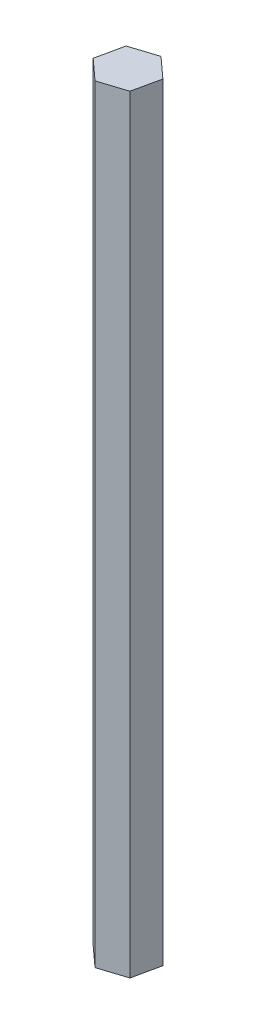
ISO-10303-21;
HEADER;
FILE_DESCRIPTION(('STEP AP214'),'2;1');
FILE_NAME('part.step','',(''),(''),'','','');
FILE_SCHEMA(('AUTOMOTIVE_DESIGN { 1 0 10303 214 1 1 1 1 }'));
ENDSEC;
DATA;
#1=APPLICATION_CONTEXT('core data for automotive mechanical design processes');
#2=APPLICATION_PROTOCOL_DEFINITION('international standard','automotive_design',2000,#1);
#3=PRODUCT_CONTEXT('',#1,'mechanical');
#4=PRODUCT('Part','Part','',(#3));
#5=PRODUCT_RELATED_PRODUCT_CATEGORY('part','',(#4));
#6=PRODUCT_DEFINITION_FORMATION('','',#4);
#7=PRODUCT_DEFINITION_CONTEXT('part definition',#1,'design');
#8=PRODUCT_DEFINITION('design','',#6,#7);
#9=PRODUCT_DEFINITION_SHAPE('','',#8);
#10=(LENGTH_UNIT() NAMED_UNIT(*) SI_UNIT(.MILLI.,.METRE.));
#11=(NAMED_UNIT(*) PLANE_ANGLE_UNIT() SI_UNIT($,.RADIAN.));
#12=(NAMED_UNIT(*) SI_UNIT($,.STERADIAN.) SOLID_ANGLE_UNIT());
#13=UNCERTAINTY_MEASURE_WITH_UNIT(LENGTH_MEASURE(1.E-05),#10,'distance_accuracy_value','');
#14=(GEOMETRIC_REPRESENTATION_CONTEXT(3) GLOBAL_UNCERTAINTY_ASSIGNED_CONTEXT((#13)) GLOBAL_UNIT_ASSIGNED_CONTEXT((#10,
#11,#12)) REPRESENTATION_CONTEXT('',''));
#15=CARTESIAN_POINT('',(0.,0.,0.));
#16=DIRECTION('',(0.,0.,1.));
#17=DIRECTION('',(1.,0.,0.));
#18=AXIS2_PLACEMENT_3D('',#15,#16,#17);
#19=CARTESIAN_POINT('',(-0.61182187926995,127.,2.82117126764399));
#20=DIRECTION('',(-0.305094633460301,0.,-0.952322038300976));
#21=DIRECTION('',(-0.952322038300976,0.,0.305094633460301));
#22=AXIS2_PLACEMENT_3D('',#19,#20,#21);
#23=PLANE('',#22);
#24=DIRECTION('',(0.,-1.,0.));
#25=VECTOR('',#24,1.);
#26=CARTESIAN_POINT('',(-0.61182187926995,127.,2.82117126764399));
#27=LINE('',#26,#25);
#28=CARTESIAN_POINT('',(-0.61182187926995,127.,2.82117126764399));
#29=VERTEX_POINT('',#28);
#30=CARTESIAN_POINT('',(-0.611821879270038,47.06,2.82117126764398));
#31=VERTEX_POINT('',#30);
#32=EDGE_CURVE('E148',#29,#31,#27,.T.);
#33=ORIENTED_EDGE('',*,*,#32,.T.);
#34=DIRECTION('',(-0.952322038300984,0.,0.305094633460273));
#35=VECTOR('',#34,1.);
#36=CARTESIAN_POINT('',(2.13729504657141,47.06,1.94043892386098));
#37=LINE('',#36,#35);
#38=CARTESIAN_POINT('',(2.13729504657141,47.06,1.94043892386098));
#39=VERTEX_POINT('',#38);
#40=EDGE_CURVE('E124',#39,#31,#37,.T.);
#41=ORIENTED_EDGE('',*,*,#40,.F.);
#42=DIRECTION('',(0.,-1.,0.));
#43=VECTOR('',#42,1.);
#44=CARTESIAN_POINT('',(2.13729504657146,127.,1.94043892386091));
#45=LINE('',#44,#43);
#46=CARTESIAN_POINT('',(2.13729504657146,127.,1.94043892386091));
#47=VERTEX_POINT('',#46);
#48=EDGE_CURVE('E11',#47,#39,#45,.T.);
#49=ORIENTED_EDGE('',*,*,#48,.F.);
#50=DIRECTION('',(0.952322038300976,0.,-0.305094633460301));
#51=VECTOR('',#50,1.);
#52=CARTESIAN_POINT('',(-0.61182187926995,127.,2.82117126764399));
#53=LINE('',#52,#51);
#54=EDGE_CURVE('E133',#29,#47,#53,.T.);
#55=ORIENTED_EDGE('',*,*,#54,.F.);
#56=EDGE_LOOP('',(#33,#41,#49,#55));
#57=FACE_BOUND('',#56,.T.);
#58=ADVANCED_FACE('F39',(#57),#23,.F.);
#59=CARTESIAN_POINT('',(2.13729504657146,127.,1.94043892386091));
#60=DIRECTION('',(-0.977282394482572,0.,-0.211941316015566));
#61=DIRECTION('',(-0.211941316015566,0.,0.977282394482572));
#62=AXIS2_PLACEMENT_3D('',#59,#60,#61);
#63=PLANE('',#62);
#64=ORIENTED_EDGE('',*,*,#48,.T.);
#65=DIRECTION('',(-0.211941316015594,0.,0.977282394482566));
#66=VECTOR('',#65,1.);
#67=CARTESIAN_POINT('',(2.74911692584145,47.06,-0.880732343782998));
#68=LINE('',#67,#66);
#69=CARTESIAN_POINT('',(2.74911692584145,47.06,-0.880732343782998));
#70=VERTEX_POINT('',#69);
#71=EDGE_CURVE('E112',#70,#39,#68,.T.);
#72=ORIENTED_EDGE('',*,*,#71,.F.);
#73=DIRECTION('',(0.,-1.,0.));
#74=VECTOR('',#73,1.);
#75=CARTESIAN_POINT('',(2.74911692584142,127.,-0.880732343783076));
#76=LINE('',#75,#74);
#77=CARTESIAN_POINT('',(2.74911692584142,127.,-0.880732343783076));
#78=VERTEX_POINT('',#77);
#79=EDGE_CURVE('E47',#78,#70,#76,.T.);
#80=ORIENTED_EDGE('',*,*,#79,.F.);
#81=DIRECTION('',(0.211941316015566,0.,-0.977282394482572));
#82=VECTOR('',#81,1.);
#83=CARTESIAN_POINT('',(2.13729504657146,127.,1.94043892386091));
#84=LINE('',#83,#82);
#85=EDGE_CURVE('E136',#47,#78,#84,.T.);
#86=ORIENTED_EDGE('',*,*,#85,.F.);
#87=EDGE_LOOP('',(#64,#72,#80,#86));
#88=FACE_BOUND('',#87,.T.);
#89=ADVANCED_FACE('F167',(#88),#63,.F.);
#90=CARTESIAN_POINT('',(2.74911692584142,127.,-0.880732343783076));
#91=DIRECTION('',(-0.672187761022271,0.,0.74038072228541));
#92=DIRECTION('',(0.74038072228541,0.,0.672187761022271));
#93=AXIS2_PLACEMENT_3D('',#90,#91,#92);
#94=PLANE('',#93);
#95=ORIENTED_EDGE('',*,*,#79,.T.);
#96=DIRECTION('',(0.74038072228539,0.,0.672187761022294));
#97=VECTOR('',#96,1.);
#98=CARTESIAN_POINT('',(0.611821879270039,47.06,-2.82117126764398));
#99=LINE('',#98,#97);
#100=CARTESIAN_POINT('',(0.611821879270039,47.06,-2.82117126764398));
#101=VERTEX_POINT('',#100);
#102=EDGE_CURVE('E105',#101,#70,#99,.T.);
#103=ORIENTED_EDGE('',*,*,#102,.F.);
#104=DIRECTION('',(0.,-1.,0.));
#105=VECTOR('',#104,1.);
#106=CARTESIAN_POINT('',(0.611821879269952,127.,-2.82117126764399));
#107=LINE('',#106,#105);
#108=CARTESIAN_POINT('',(0.611821879269952,127.,-2.82117126764399));
#109=VERTEX_POINT('',#108);
#110=EDGE_CURVE('E92',#109,#101,#107,.T.);
#111=ORIENTED_EDGE('',*,*,#110,.F.);
#112=DIRECTION('',(-0.74038072228541,0.,-0.672187761022271));
#113=VECTOR('',#112,1.);
#114=CARTESIAN_POINT('',(2.74911692584142,127.,-0.880732343783076));
#115=LINE('',#114,#113);
#116=EDGE_CURVE('E139',#78,#109,#115,.T.);
#117=ORIENTED_EDGE('',*,*,#116,.F.);
#118=EDGE_LOOP('',(#95,#103,#111,#117));
#119=FACE_BOUND('',#118,.T.);
#120=ADVANCED_FACE('F106',(#119),#94,.F.);
#121=CARTESIAN_POINT('',(0.611821879269952,127.,-2.82117126764399));
#122=DIRECTION('',(0.305094633460301,0.,0.952322038300975));
#123=DIRECTION('',(0.952322038300976,0.,-0.305094633460301));
#124=AXIS2_PLACEMENT_3D('',#121,#122,#123);
#125=PLANE('',#124);
#126=ORIENTED_EDGE('',*,*,#110,.T.);
#127=DIRECTION('',(0.952322038300984,0.,-0.305094633460273));
#128=VECTOR('',#127,1.);
#129=CARTESIAN_POINT('',(-2.13729504657141,47.06,-1.94043892386098));
#130=LINE('',#129,#128);
#131=CARTESIAN_POINT('',(-2.13729504657141,47.06,-1.94043892386098));
#132=VERTEX_POINT('',#131);
#133=EDGE_CURVE('E97',#132,#101,#130,.T.);
#134=ORIENTED_EDGE('',*,*,#133,.F.);
#135=DIRECTION('',(0.,-1.,0.));
#136=VECTOR('',#135,1.);
#137=CARTESIAN_POINT('',(-2.13729504657146,127.,-1.94043892386091));
#138=LINE('',#137,#136);
#139=CARTESIAN_POINT('',(-2.13729504657146,127.,-1.94043892386091));
#140=VERTEX_POINT('',#139);
#141=EDGE_CURVE('E102',#140,#132,#138,.T.);
#142=ORIENTED_EDGE('',*,*,#141,.F.);
#143=DIRECTION('',(-0.952322038300976,0.,0.305094633460301));
#144=VECTOR('',#143,1.);
#145=CARTESIAN_POINT('',(0.611821879269952,127.,-2.82117126764399));
#146=LINE('',#145,#144);
#147=EDGE_CURVE('E98',#109,#140,#146,.T.);
#148=ORIENTED_EDGE('',*,*,#147,.F.);
#149=EDGE_LOOP('',(#126,#134,#142,#148));
#150=FACE_BOUND('',#149,.T.);
#151=ADVANCED_FACE('F94',(#150),#125,.F.);
#152=CARTESIAN_POINT('',(-2.13729504657146,127.,-1.94043892386091));
#153=DIRECTION('',(0.977282394482573,0.,0.211941316015565));
#154=DIRECTION('',(0.211941316015565,0.,-0.977282394482573));
#155=AXIS2_PLACEMENT_3D('',#152,#153,#154);
#156=PLANE('',#155);
#157=ORIENTED_EDGE('',*,*,#141,.T.);
#158=DIRECTION('',(0.211941316015594,0.,-0.977282394482566));
#159=VECTOR('',#158,1.);
#160=CARTESIAN_POINT('',(-2.74911692584145,47.06,0.880732343783));
#161=LINE('',#160,#159);
#162=CARTESIAN_POINT('',(-2.74911692584145,47.06,0.880732343783));
#163=VERTEX_POINT('',#162);
#164=EDGE_CURVE('E118',#163,#132,#161,.T.);
#165=ORIENTED_EDGE('',*,*,#164,.F.);
#166=DIRECTION('',(0.,-1.,0.));
#167=VECTOR('',#166,1.);
#168=CARTESIAN_POINT('',(-2.74911692584141,127.,0.88073234378308));
#169=LINE('',#168,#167);
#170=CARTESIAN_POINT('',(-2.74911692584141,127.,0.88073234378308));
#171=VERTEX_POINT('',#170);
#172=EDGE_CURVE('E151',#171,#163,#169,.T.);
#173=ORIENTED_EDGE('',*,*,#172,.F.);
#174=DIRECTION('',(-0.211941316015565,0.,0.977282394482572));
#175=VECTOR('',#174,1.);
#176=CARTESIAN_POINT('',(-2.13729504657146,127.,-1.94043892386091));
#177=LINE('',#176,#175);
#178=EDGE_CURVE('E59',#140,#171,#177,.T.);
#179=ORIENTED_EDGE('',*,*,#178,.F.);
#180=EDGE_LOOP('',(#157,#165,#173,#179));
#181=FACE_BOUND('',#180,.T.);
#182=ADVANCED_FACE('F157',(#181),#156,.F.);
#183=CARTESIAN_POINT('',(-2.74911692584141,127.,0.88073234378308));
#184=DIRECTION('',(0.672187761022271,0.,-0.74038072228541));
#185=DIRECTION('',(-0.740380722285411,0.,-0.672187761022271));
#186=AXIS2_PLACEMENT_3D('',#183,#184,#185);
#187=PLANE('',#186);
#188=ORIENTED_EDGE('',*,*,#172,.T.);
#189=DIRECTION('',(-0.74038072228539,0.,-0.672187761022293));
#190=VECTOR('',#189,1.);
#191=CARTESIAN_POINT('',(-0.611821879270038,47.06,2.82117126764398));
#192=LINE('',#191,#190);
#193=EDGE_CURVE('E128',#31,#163,#192,.T.);
#194=ORIENTED_EDGE('',*,*,#193,.F.);
#195=ORIENTED_EDGE('',*,*,#32,.F.);
#196=DIRECTION('',(0.740380722285411,0.,0.672187761022271));
#197=VECTOR('',#196,1.);
#198=CARTESIAN_POINT('',(-2.74911692584141,127.,0.88073234378308));
#199=LINE('',#198,#197);
#200=EDGE_CURVE('E54',#171,#29,#199,.T.);
#201=ORIENTED_EDGE('',*,*,#200,.F.);
#202=EDGE_LOOP('',(#188,#194,#195,#201));
#203=FACE_BOUND('',#202,.T.);
#204=ADVANCED_FACE('F160',(#203),#187,.F.);
#205=CARTESIAN_POINT('',(0.,127.,0.));
#206=DIRECTION('',(0.,1.,0.));
#207=DIRECTION('',(0.,0.,1.));
#208=AXIS2_PLACEMENT_3D('',#205,#206,#207);
#209=PLANE('',#208);
#210=ORIENTED_EDGE('',*,*,#54,.T.);
#211=ORIENTED_EDGE('',*,*,#85,.T.);
#212=ORIENTED_EDGE('',*,*,#116,.T.);
#213=ORIENTED_EDGE('',*,*,#147,.T.);
#214=ORIENTED_EDGE('',*,*,#178,.T.);
#215=ORIENTED_EDGE('',*,*,#200,.T.);
#216=EDGE_LOOP('',(#210,#211,#212,#213,#214,#215));
#217=FACE_BOUND('',#216,.T.);
#218=ADVANCED_FACE('F165',(#217),#209,.T.);
#219=CARTESIAN_POINT('',(0.,47.06,0.));
#220=DIRECTION('',(0.,-1.,0.));
#221=DIRECTION('',(0.,0.,-1.));
#222=AXIS2_PLACEMENT_3D('',#219,#220,#221);
#223=PLANE('',#222);
#224=ORIENTED_EDGE('',*,*,#133,.T.);
#225=ORIENTED_EDGE('',*,*,#102,.T.);
#226=ORIENTED_EDGE('',*,*,#71,.T.);
#227=ORIENTED_EDGE('',*,*,#40,.T.);
#228=ORIENTED_EDGE('',*,*,#193,.T.);
#229=ORIENTED_EDGE('',*,*,#164,.T.);
#230=EDGE_LOOP('',(#224,#225,#226,#227,#228,#229));
#231=FACE_BOUND('',#230,.T.);
#232=ADVANCED_FACE('F115',(#231),#223,.T.);
#233=CLOSED_SHELL('',(#58,#89,#120,#151,#182,#204,#218,#232));
#234=MANIFOLD_SOLID_BREP('B2',#233);
#235=ADVANCED_BREP_SHAPE_REPRESENTATION('',(#18,#234),#14);
#236=SHAPE_DEFINITION_REPRESENTATION(#9,#235);
ENDSEC;
END-ISO-10303-21;
